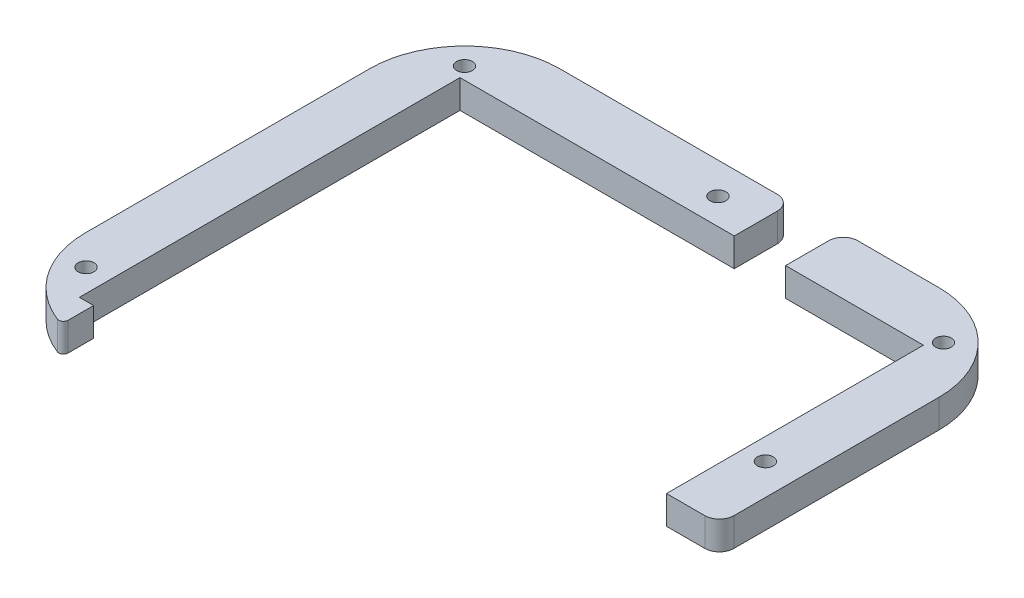
ISO-10303-21;
HEADER;
FILE_DESCRIPTION(('STEP AP214'),'2;1');
FILE_NAME('part.step','',(''),(''),'','','');
FILE_SCHEMA(('AUTOMOTIVE_DESIGN { 1 0 10303 214 1 1 1 1 }'));
ENDSEC;
DATA;
#1=APPLICATION_CONTEXT('core data for automotive mechanical design processes');
#2=APPLICATION_PROTOCOL_DEFINITION('international standard','automotive_design',2000,#1);
#3=PRODUCT_CONTEXT('',#1,'mechanical');
#4=PRODUCT('Part','Part','',(#3));
#5=PRODUCT_RELATED_PRODUCT_CATEGORY('part','',(#4));
#6=PRODUCT_DEFINITION_FORMATION('','',#4);
#7=PRODUCT_DEFINITION_CONTEXT('part definition',#1,'design');
#8=PRODUCT_DEFINITION('design','',#6,#7);
#9=PRODUCT_DEFINITION_SHAPE('','',#8);
#10=(LENGTH_UNIT() NAMED_UNIT(*) SI_UNIT(.MILLI.,.METRE.));
#11=(NAMED_UNIT(*) PLANE_ANGLE_UNIT() SI_UNIT($,.RADIAN.));
#12=(NAMED_UNIT(*) SI_UNIT($,.STERADIAN.) SOLID_ANGLE_UNIT());
#13=UNCERTAINTY_MEASURE_WITH_UNIT(LENGTH_MEASURE(1.E-05),#10,'distance_accuracy_value','');
#14=(GEOMETRIC_REPRESENTATION_CONTEXT(3) GLOBAL_UNCERTAINTY_ASSIGNED_CONTEXT((#13)) GLOBAL_UNIT_ASSIGNED_CONTEXT((#10,
#11,#12)) REPRESENTATION_CONTEXT('',''));
#15=CARTESIAN_POINT('',(0.,0.,0.));
#16=DIRECTION('',(0.,0.,1.));
#17=DIRECTION('',(1.,0.,0.));
#18=AXIS2_PLACEMENT_3D('',#15,#16,#17);
#19=CARTESIAN_POINT('',(-40.,6.,-50.08));
#20=DIRECTION('',(0.,0.,1.));
#21=DIRECTION('',(1.,0.,0.));
#22=AXIS2_PLACEMENT_3D('',#19,#20,#21);
#23=PLANE('',#22);
#24=DIRECTION('',(-1.,0.,0.));
#25=VECTOR('',#24,1.);
#26=CARTESIAN_POINT('',(-40.,0.,-50.08));
#27=LINE('',#26,#25);
#28=CARTESIAN_POINT('',(40.,0.,-50.08));
#29=VERTEX_POINT('',#28);
#30=CARTESIAN_POINT('',(22.9,0.,-50.08));
#31=VERTEX_POINT('',#30);
#32=EDGE_CURVE('E132',#29,#31,#27,.T.);
#33=ORIENTED_EDGE('',*,*,#32,.T.);
#34=DIRECTION('',(0.,1.,0.));
#35=VECTOR('',#34,1.);
#36=CARTESIAN_POINT('',(22.9,6.,-50.08));
#37=LINE('',#36,#35);
#38=CARTESIAN_POINT('',(22.9,6.,-50.08));
#39=VERTEX_POINT('',#38);
#40=EDGE_CURVE('E153',#31,#39,#37,.T.);
#41=ORIENTED_EDGE('',*,*,#40,.T.);
#42=DIRECTION('',(-1.,0.,0.));
#43=VECTOR('',#42,1.);
#44=CARTESIAN_POINT('',(-40.,6.,-50.08));
#45=LINE('',#44,#43);
#46=CARTESIAN_POINT('',(40.,6.,-50.08));
#47=VERTEX_POINT('',#46);
#48=EDGE_CURVE('E122',#47,#39,#45,.T.);
#49=ORIENTED_EDGE('',*,*,#48,.F.);
#50=DIRECTION('',(0.,1.,0.));
#51=VECTOR('',#50,1.);
#52=CARTESIAN_POINT('',(40.,6.,-50.08));
#53=LINE('',#52,#51);
#54=EDGE_CURVE('E136',#47,#29,#53,.F.);
#55=ORIENTED_EDGE('',*,*,#54,.T.);
#56=EDGE_LOOP('',(#33,#41,#49,#55));
#57=FACE_BOUND('',#56,.T.);
#58=ADVANCED_FACE('F44',(#57),#23,.F.);
#59=CARTESIAN_POINT('',(-40.,6.,-30.));
#60=DIRECTION('',(0.,1.,0.));
#61=DIRECTION('',(0.,0.,1.));
#62=AXIS2_PLACEMENT_3D('',#59,#60,#61);
#63=PLANE('',#62);
#64=CARTESIAN_POINT('',(53.475,6.,0.));
#65=DIRECTION('',(0.,1.,0.));
#66=DIRECTION('',(0.,0.,1.));
#67=AXIS2_PLACEMENT_3D('',#64,#65,#66);
#68=CIRCLE('',#67,1.67000000000001);
#69=CARTESIAN_POINT('',(53.475,6.,1.67000000000001));
#70=VERTEX_POINT('',#69);
#71=EDGE_CURVE('E48',#70,#70,#68,.T.);
#72=ORIENTED_EDGE('',*,*,#71,.F.);
#73=EDGE_LOOP('',(#72));
#74=FACE_BOUND('',#73,.T.);
#75=CARTESIAN_POINT('',(50.5585567633134,6.,-40.5085567633134));
#76=DIRECTION('',(0.,1.,0.));
#77=DIRECTION('',(0.,0.,1.));
#78=AXIS2_PLACEMENT_3D('',#75,#76,#77);
#79=CIRCLE('',#78,1.67);
#80=CARTESIAN_POINT('',(50.5585567633134,6.,-38.8385567633134));
#81=VERTEX_POINT('',#80);
#82=EDGE_CURVE('E143',#81,#81,#79,.T.);
#83=ORIENTED_EDGE('',*,*,#82,.F.);
#84=EDGE_LOOP('',(#83));
#85=FACE_BOUND('',#84,.T.);
#86=ORIENTED_EDGE('',*,*,#48,.T.);
#87=CARTESIAN_POINT('',(22.9,6.,-47.));
#88=DIRECTION('',(0.,1.,0.));
#89=DIRECTION('',(0.,0.,1.));
#90=AXIS2_PLACEMENT_3D('',#87,#88,#89);
#91=CIRCLE('',#90,3.08);
#92=CARTESIAN_POINT('',(19.82,6.,-47.));
#93=VERTEX_POINT('',#92);
#94=EDGE_CURVE('E151',#39,#93,#91,.T.);
#95=ORIENTED_EDGE('',*,*,#94,.T.);
#96=DIRECTION('',(0.,0.,-1.));
#97=VECTOR('',#96,1.);
#98=CARTESIAN_POINT('',(19.82,6.,-30.));
#99=LINE('',#98,#97);
#100=CARTESIAN_POINT('',(19.82,6.,-37.92));
#101=VERTEX_POINT('',#100);
#102=EDGE_CURVE('E154',#101,#93,#99,.T.);
#103=ORIENTED_EDGE('',*,*,#102,.F.);
#104=DIRECTION('',(-1.,0.,0.));
#105=VECTOR('',#104,1.);
#106=CARTESIAN_POINT('',(-40.,6.,-37.92));
#107=LINE('',#106,#105);
#108=CARTESIAN_POINT('',(48.92,6.,-37.92));
#109=VERTEX_POINT('',#108);
#110=EDGE_CURVE('E104',#109,#101,#107,.T.);
#111=ORIENTED_EDGE('',*,*,#110,.F.);
#112=DIRECTION('',(0.,0.,-1.));
#113=VECTOR('',#112,1.);
#114=CARTESIAN_POINT('',(48.92,6.,-30.));
#115=LINE('',#114,#113);
#116=CARTESIAN_POINT('',(48.92,6.,16.32));
#117=VERTEX_POINT('',#116);
#118=EDGE_CURVE('E111',#117,#109,#115,.T.);
#119=ORIENTED_EDGE('',*,*,#118,.F.);
#120=DIRECTION('',(-1.,0.,0.));
#121=VECTOR('',#120,1.);
#122=CARTESIAN_POINT('',(-40.,6.,16.32));
#123=LINE('',#122,#121);
#124=CARTESIAN_POINT('',(57.,6.,16.32));
#125=VERTEX_POINT('',#124);
#126=EDGE_CURVE('E171',#125,#117,#123,.T.);
#127=ORIENTED_EDGE('',*,*,#126,.F.);
#128=CARTESIAN_POINT('',(57.,6.,13.24));
#129=DIRECTION('',(0.,1.,0.));
#130=DIRECTION('',(0.,0.,1.));
#131=AXIS2_PLACEMENT_3D('',#128,#129,#130);
#132=CIRCLE('',#131,3.08);
#133=CARTESIAN_POINT('',(60.08,6.,13.24));
#134=VERTEX_POINT('',#133);
#135=EDGE_CURVE('E159',#125,#134,#132,.T.);
#136=ORIENTED_EDGE('',*,*,#135,.T.);
#137=DIRECTION('',(0.,0.,-1.));
#138=VECTOR('',#137,1.);
#139=CARTESIAN_POINT('',(60.08,6.,-30.));
#140=LINE('',#139,#138);
#141=CARTESIAN_POINT('',(60.08,6.,-30.));
#142=VERTEX_POINT('',#141);
#143=EDGE_CURVE('E180',#134,#142,#140,.T.);
#144=ORIENTED_EDGE('',*,*,#143,.T.);
#145=CARTESIAN_POINT('',(40.,6.,-30.));
#146=DIRECTION('',(0.,1.,0.));
#147=DIRECTION('',(0.,0.,1.));
#148=AXIS2_PLACEMENT_3D('',#145,#146,#147);
#149=CIRCLE('',#148,20.08);
#150=EDGE_CURVE('E127',#142,#47,#149,.T.);
#151=ORIENTED_EDGE('',*,*,#150,.T.);
#152=EDGE_LOOP('',(#86,#95,#103,#111,#119,#127,#136,#144,#151));
#153=FACE_BOUND('',#152,.T.);
#154=ADVANCED_FACE('F202',(#74,#85,#153),#63,.T.);
#155=CARTESIAN_POINT('',(-40.,0.,-30.));
#156=DIRECTION('',(0.,1.,0.));
#157=DIRECTION('',(0.,0.,1.));
#158=AXIS2_PLACEMENT_3D('',#155,#156,#157);
#159=PLANE('',#158);
#160=CARTESIAN_POINT('',(53.475,0.,0.));
#161=DIRECTION('',(0.,1.,0.));
#162=DIRECTION('',(0.,0.,1.));
#163=AXIS2_PLACEMENT_3D('',#160,#161,#162);
#164=CIRCLE('',#163,1.67000000000001);
#165=CARTESIAN_POINT('',(53.475,0.,1.67000000000001));
#166=VERTEX_POINT('',#165);
#167=EDGE_CURVE('E130',#166,#166,#164,.T.);
#168=ORIENTED_EDGE('',*,*,#167,.T.);
#169=EDGE_LOOP('',(#168));
#170=FACE_BOUND('',#169,.T.);
#171=CARTESIAN_POINT('',(50.5585567633134,0.,-40.5085567633134));
#172=DIRECTION('',(0.,1.,0.));
#173=DIRECTION('',(0.,0.,1.));
#174=AXIS2_PLACEMENT_3D('',#171,#172,#173);
#175=CIRCLE('',#174,1.67);
#176=CARTESIAN_POINT('',(50.5585567633134,0.,-38.8385567633134));
#177=VERTEX_POINT('',#176);
#178=EDGE_CURVE('E139',#177,#177,#175,.T.);
#179=ORIENTED_EDGE('',*,*,#178,.T.);
#180=EDGE_LOOP('',(#179));
#181=FACE_BOUND('',#180,.T.);
#182=DIRECTION('',(0.,0.,-1.));
#183=VECTOR('',#182,1.);
#184=CARTESIAN_POINT('',(19.82,0.,-30.));
#185=LINE('',#184,#183);
#186=CARTESIAN_POINT('',(19.82,0.,-37.92));
#187=VERTEX_POINT('',#186);
#188=CARTESIAN_POINT('',(19.82,0.,-47.));
#189=VERTEX_POINT('',#188);
#190=EDGE_CURVE('E121',#187,#189,#185,.T.);
#191=ORIENTED_EDGE('',*,*,#190,.T.);
#192=CARTESIAN_POINT('',(22.9,0.,-47.));
#193=DIRECTION('',(0.,1.,0.));
#194=DIRECTION('',(0.,0.,1.));
#195=AXIS2_PLACEMENT_3D('',#192,#193,#194);
#196=CIRCLE('',#195,3.08);
#197=EDGE_CURVE('E13',#189,#31,#196,.F.);
#198=ORIENTED_EDGE('',*,*,#197,.T.);
#199=ORIENTED_EDGE('',*,*,#32,.F.);
#200=CARTESIAN_POINT('',(40.,0.,-30.));
#201=DIRECTION('',(0.,1.,0.));
#202=DIRECTION('',(0.,0.,1.));
#203=AXIS2_PLACEMENT_3D('',#200,#201,#202);
#204=CIRCLE('',#203,20.08);
#205=CARTESIAN_POINT('',(60.08,0.,-30.));
#206=VERTEX_POINT('',#205);
#207=EDGE_CURVE('E164',#206,#29,#204,.T.);
#208=ORIENTED_EDGE('',*,*,#207,.F.);
#209=DIRECTION('',(0.,0.,-1.));
#210=VECTOR('',#209,1.);
#211=CARTESIAN_POINT('',(60.08,0.,-30.));
#212=LINE('',#211,#210);
#213=CARTESIAN_POINT('',(60.08,0.,13.24));
#214=VERTEX_POINT('',#213);
#215=EDGE_CURVE('E167',#214,#206,#212,.T.);
#216=ORIENTED_EDGE('',*,*,#215,.F.);
#217=CARTESIAN_POINT('',(57.,0.,13.24));
#218=DIRECTION('',(0.,1.,0.));
#219=DIRECTION('',(0.,0.,1.));
#220=AXIS2_PLACEMENT_3D('',#217,#218,#219);
#221=CIRCLE('',#220,3.08);
#222=CARTESIAN_POINT('',(57.,0.,16.32));
#223=VERTEX_POINT('',#222);
#224=EDGE_CURVE('E124',#214,#223,#221,.F.);
#225=ORIENTED_EDGE('',*,*,#224,.T.);
#226=DIRECTION('',(-1.,0.,0.));
#227=VECTOR('',#226,1.);
#228=CARTESIAN_POINT('',(-40.,0.,16.32));
#229=LINE('',#228,#227);
#230=CARTESIAN_POINT('',(48.92,0.,16.32));
#231=VERTEX_POINT('',#230);
#232=EDGE_CURVE('E100',#223,#231,#229,.T.);
#233=ORIENTED_EDGE('',*,*,#232,.T.);
#234=DIRECTION('',(0.,0.,-1.));
#235=VECTOR('',#234,1.);
#236=CARTESIAN_POINT('',(48.92,0.,-30.));
#237=LINE('',#236,#235);
#238=CARTESIAN_POINT('',(48.92,0.,-37.92));
#239=VERTEX_POINT('',#238);
#240=EDGE_CURVE('E94',#231,#239,#237,.T.);
#241=ORIENTED_EDGE('',*,*,#240,.T.);
#242=DIRECTION('',(-1.,0.,0.));
#243=VECTOR('',#242,1.);
#244=CARTESIAN_POINT('',(-40.,0.,-37.92));
#245=LINE('',#244,#243);
#246=EDGE_CURVE('E98',#239,#187,#245,.T.);
#247=ORIENTED_EDGE('',*,*,#246,.T.);
#248=EDGE_LOOP('',(#191,#198,#199,#208,#216,#225,#233,#241,#247));
#249=FACE_BOUND('',#248,.T.);
#250=ADVANCED_FACE('F96',(#170,#181,#249),#159,.F.);
#251=CARTESIAN_POINT('',(-49.,0.,-37.92));
#252=DIRECTION('',(0.,0.,-1.));
#253=DIRECTION('',(-1.,0.,0.));
#254=AXIS2_PLACEMENT_3D('',#251,#252,#253);
#255=PLANE('',#254);
#256=ORIENTED_EDGE('',*,*,#110,.T.);
#257=DIRECTION('',(0.,1.,0.));
#258=VECTOR('',#257,1.);
#259=CARTESIAN_POINT('',(19.82,0.,-37.92));
#260=LINE('',#259,#258);
#261=EDGE_CURVE('E120',#187,#101,#260,.T.);
#262=ORIENTED_EDGE('',*,*,#261,.F.);
#263=ORIENTED_EDGE('',*,*,#246,.F.);
#264=DIRECTION('',(0.,1.,0.));
#265=VECTOR('',#264,1.);
#266=CARTESIAN_POINT('',(48.92,0.,-37.92));
#267=LINE('',#266,#265);
#268=EDGE_CURVE('E108',#239,#109,#267,.T.);
#269=ORIENTED_EDGE('',*,*,#268,.T.);
#270=EDGE_LOOP('',(#256,#262,#263,#269));
#271=FACE_BOUND('',#270,.T.);
#272=ADVANCED_FACE('F118',(#271),#255,.F.);
#273=CARTESIAN_POINT('',(60.08,6.,-30.));
#274=DIRECTION('',(-1.,0.,0.));
#275=DIRECTION('',(0.,0.,1.));
#276=AXIS2_PLACEMENT_3D('',#273,#274,#275);
#277=PLANE('',#276);
#278=ORIENTED_EDGE('',*,*,#143,.F.);
#279=DIRECTION('',(0.,1.,0.));
#280=VECTOR('',#279,1.);
#281=CARTESIAN_POINT('',(60.08,6.,13.24));
#282=LINE('',#281,#280);
#283=EDGE_CURVE('E115',#134,#214,#282,.F.);
#284=ORIENTED_EDGE('',*,*,#283,.T.);
#285=ORIENTED_EDGE('',*,*,#215,.T.);
#286=DIRECTION('',(0.,-1.,0.));
#287=VECTOR('',#286,1.);
#288=CARTESIAN_POINT('',(60.08,6.,-30.));
#289=LINE('',#288,#287);
#290=EDGE_CURVE('E160',#142,#206,#289,.T.);
#291=ORIENTED_EDGE('',*,*,#290,.F.);
#292=EDGE_LOOP('',(#278,#284,#285,#291));
#293=FACE_BOUND('',#292,.T.);
#294=ADVANCED_FACE('F207',(#293),#277,.F.);
#295=CARTESIAN_POINT('',(40.,6.,-30.));
#296=DIRECTION('',(0.,-1.,0.));
#297=DIRECTION('',(0.,0.,-1.));
#298=AXIS2_PLACEMENT_3D('',#295,#296,#297);
#299=CYLINDRICAL_SURFACE('',#298,20.08);
#300=ORIENTED_EDGE('',*,*,#207,.T.);
#301=ORIENTED_EDGE('',*,*,#54,.F.);
#302=ORIENTED_EDGE('',*,*,#150,.F.);
#303=ORIENTED_EDGE('',*,*,#290,.T.);
#304=EDGE_LOOP('',(#300,#301,#302,#303));
#305=FACE_BOUND('',#304,.T.);
#306=ADVANCED_FACE('F212',(#305),#299,.T.);
#307=CARTESIAN_POINT('',(48.92,0.,-38.));
#308=DIRECTION('',(1.,0.,0.));
#309=DIRECTION('',(0.,0.,-1.));
#310=AXIS2_PLACEMENT_3D('',#307,#308,#309);
#311=PLANE('',#310);
#312=ORIENTED_EDGE('',*,*,#240,.F.);
#313=DIRECTION('',(0.,1.,0.));
#314=VECTOR('',#313,1.);
#315=CARTESIAN_POINT('',(48.92,0.,16.32));
#316=LINE('',#315,#314);
#317=EDGE_CURVE('E163',#231,#117,#316,.T.);
#318=ORIENTED_EDGE('',*,*,#317,.T.);
#319=ORIENTED_EDGE('',*,*,#118,.T.);
#320=ORIENTED_EDGE('',*,*,#268,.F.);
#321=EDGE_LOOP('',(#312,#318,#319,#320));
#322=FACE_BOUND('',#321,.T.);
#323=ADVANCED_FACE('F109',(#322),#311,.F.);
#324=CARTESIAN_POINT('',(49.,0.,16.32));
#325=DIRECTION('',(0.,0.,-1.));
#326=DIRECTION('',(-1.,0.,0.));
#327=AXIS2_PLACEMENT_3D('',#324,#325,#326);
#328=PLANE('',#327);
#329=ORIENTED_EDGE('',*,*,#232,.F.);
#330=DIRECTION('',(0.,1.,0.));
#331=VECTOR('',#330,1.);
#332=CARTESIAN_POINT('',(57.,0.,16.32));
#333=LINE('',#332,#331);
#334=EDGE_CURVE('E168',#223,#125,#333,.T.);
#335=ORIENTED_EDGE('',*,*,#334,.T.);
#336=ORIENTED_EDGE('',*,*,#126,.T.);
#337=ORIENTED_EDGE('',*,*,#317,.F.);
#338=EDGE_LOOP('',(#329,#335,#336,#337));
#339=FACE_BOUND('',#338,.T.);
#340=ADVANCED_FACE('F46',(#339),#328,.F.);
#341=CARTESIAN_POINT('',(57.,6.,13.24));
#342=DIRECTION('',(0.,-1.,0.));
#343=DIRECTION('',(0.,0.,-1.));
#344=AXIS2_PLACEMENT_3D('',#341,#342,#343);
#345=CYLINDRICAL_SURFACE('',#344,3.08);
#346=ORIENTED_EDGE('',*,*,#135,.F.);
#347=ORIENTED_EDGE('',*,*,#334,.F.);
#348=ORIENTED_EDGE('',*,*,#224,.F.);
#349=ORIENTED_EDGE('',*,*,#283,.F.);
#350=EDGE_LOOP('',(#346,#347,#348,#349));
#351=FACE_BOUND('',#350,.T.);
#352=ADVANCED_FACE('F197',(#351),#345,.T.);
#353=CARTESIAN_POINT('',(19.82,0.,-50.));
#354=DIRECTION('',(1.,0.,0.));
#355=DIRECTION('',(0.,0.,-1.));
#356=AXIS2_PLACEMENT_3D('',#353,#354,#355);
#357=PLANE('',#356);
#358=ORIENTED_EDGE('',*,*,#102,.T.);
#359=DIRECTION('',(0.,1.,0.));
#360=VECTOR('',#359,1.);
#361=CARTESIAN_POINT('',(19.82,0.,-47.));
#362=LINE('',#361,#360);
#363=EDGE_CURVE('E54',#93,#189,#362,.F.);
#364=ORIENTED_EDGE('',*,*,#363,.T.);
#365=ORIENTED_EDGE('',*,*,#190,.F.);
#366=ORIENTED_EDGE('',*,*,#261,.T.);
#367=EDGE_LOOP('',(#358,#364,#365,#366));
#368=FACE_BOUND('',#367,.T.);
#369=ADVANCED_FACE('F223',(#368),#357,.F.);
#370=CARTESIAN_POINT('',(22.9,6.,-47.));
#371=DIRECTION('',(0.,1.,0.));
#372=DIRECTION('',(0.,0.,1.));
#373=AXIS2_PLACEMENT_3D('',#370,#371,#372);
#374=CYLINDRICAL_SURFACE('',#373,3.08);
#375=ORIENTED_EDGE('',*,*,#197,.F.);
#376=ORIENTED_EDGE('',*,*,#363,.F.);
#377=ORIENTED_EDGE('',*,*,#94,.F.);
#378=ORIENTED_EDGE('',*,*,#40,.F.);
#379=EDGE_LOOP('',(#375,#376,#377,#378));
#380=FACE_BOUND('',#379,.T.);
#381=ADVANCED_FACE('F219',(#380),#374,.T.);
#382=CARTESIAN_POINT('',(50.5585567633134,0.,-40.5085567633134));
#383=DIRECTION('',(0.,1.,0.));
#384=DIRECTION('',(0.,0.,1.));
#385=AXIS2_PLACEMENT_3D('',#382,#383,#384);
#386=CYLINDRICAL_SURFACE('',#385,1.67);
#387=ORIENTED_EDGE('',*,*,#178,.F.);
#388=EDGE_LOOP('',(#387));
#389=FACE_BOUND('',#388,.T.);
#390=ORIENTED_EDGE('',*,*,#82,.T.);
#391=EDGE_LOOP('',(#390));
#392=FACE_BOUND('',#391,.T.);
#393=ADVANCED_FACE('F233',(#389,#392),#386,.F.);
#394=CARTESIAN_POINT('',(53.475,0.,0.));
#395=DIRECTION('',(0.,1.,0.));
#396=DIRECTION('',(0.,0.,1.));
#397=AXIS2_PLACEMENT_3D('',#394,#395,#396);
#398=CYLINDRICAL_SURFACE('',#397,1.67000000000001);
#399=ORIENTED_EDGE('',*,*,#167,.F.);
#400=EDGE_LOOP('',(#399));
#401=FACE_BOUND('',#400,.T.);
#402=ORIENTED_EDGE('',*,*,#71,.T.);
#403=EDGE_LOOP('',(#402));
#404=FACE_BOUND('',#403,.T.);
#405=ADVANCED_FACE('F259',(#401,#404),#398,.F.);
#406=CLOSED_SHELL('',(#58,#154,#250,#272,#294,#306,#323,#340,#352,#369,#381,#393,#405));
#407=MANIFOLD_SOLID_BREP('B2',#406);
#408=CARTESIAN_POINT('',(-40.,6.,-30.));
#409=DIRECTION('',(0.,-1.,0.));
#410=DIRECTION('',(0.,0.,-1.));
#411=AXIS2_PLACEMENT_3D('',#408,#409,#410);
#412=CYLINDRICAL_SURFACE('',#411,20.08);
#413=CARTESIAN_POINT('',(-40.,0.,-30.));
#414=DIRECTION('',(0.,1.,0.));
#415=DIRECTION('',(0.,0.,1.));
#416=AXIS2_PLACEMENT_3D('',#413,#414,#415);
#417=CIRCLE('',#416,20.08);
#418=CARTESIAN_POINT('',(-40.,0.,-50.08));
#419=VERTEX_POINT('',#418);
#420=CARTESIAN_POINT('',(-60.08,0.,-30.));
#421=VERTEX_POINT('',#420);
#422=EDGE_CURVE('E433',#419,#421,#417,.T.);
#423=ORIENTED_EDGE('',*,*,#422,.T.);
#424=DIRECTION('',(0.,1.,0.));
#425=VECTOR('',#424,1.);
#426=CARTESIAN_POINT('',(-60.08,6.,-30.));
#427=LINE('',#426,#425);
#428=CARTESIAN_POINT('',(-60.08,6.,-30.));
#429=VERTEX_POINT('',#428);
#430=EDGE_CURVE('E427',#429,#421,#427,.F.);
#431=ORIENTED_EDGE('',*,*,#430,.F.);
#432=CARTESIAN_POINT('',(-40.,6.,-30.));
#433=DIRECTION('',(0.,1.,0.));
#434=DIRECTION('',(0.,0.,1.));
#435=AXIS2_PLACEMENT_3D('',#432,#433,#434);
#436=CIRCLE('',#435,20.08);
#437=CARTESIAN_POINT('',(-40.,6.,-50.08));
#438=VERTEX_POINT('',#437);
#439=EDGE_CURVE('E447',#438,#429,#436,.T.);
#440=ORIENTED_EDGE('',*,*,#439,.F.);
#441=DIRECTION('',(0.,-1.,0.));
#442=VECTOR('',#441,1.);
#443=CARTESIAN_POINT('',(-40.,6.,-50.08));
#444=LINE('',#443,#442);
#445=EDGE_CURVE('E441',#438,#419,#444,.T.);
#446=ORIENTED_EDGE('',*,*,#445,.T.);
#447=EDGE_LOOP('',(#423,#431,#440,#446));
#448=FACE_BOUND('',#447,.T.);
#449=ADVANCED_FACE('F339',(#448),#412,.T.);
#450=CARTESIAN_POINT('',(-60.08,6.,-30.));
#451=DIRECTION('',(1.,0.,0.));
#452=DIRECTION('',(0.,0.,-1.));
#453=AXIS2_PLACEMENT_3D('',#450,#451,#452);
#454=PLANE('',#453);
#455=DIRECTION('',(0.,0.,1.));
#456=VECTOR('',#455,1.);
#457=CARTESIAN_POINT('',(-60.08,0.,-30.));
#458=LINE('',#457,#456);
#459=CARTESIAN_POINT('',(-60.08,0.,30.));
#460=VERTEX_POINT('',#459);
#461=EDGE_CURVE('E421',#421,#460,#458,.T.);
#462=ORIENTED_EDGE('',*,*,#461,.T.);
#463=DIRECTION('',(0.,-1.,0.));
#464=VECTOR('',#463,1.);
#465=CARTESIAN_POINT('',(-60.08,6.,30.));
#466=LINE('',#465,#464);
#467=CARTESIAN_POINT('',(-60.08,6.,30.));
#468=VERTEX_POINT('',#467);
#469=EDGE_CURVE('E424',#468,#460,#466,.T.);
#470=ORIENTED_EDGE('',*,*,#469,.F.);
#471=DIRECTION('',(0.,0.,1.));
#472=VECTOR('',#471,1.);
#473=CARTESIAN_POINT('',(-60.08,6.,-30.));
#474=LINE('',#473,#472);
#475=EDGE_CURVE('E490',#429,#468,#474,.T.);
#476=ORIENTED_EDGE('',*,*,#475,.F.);
#477=ORIENTED_EDGE('',*,*,#430,.T.);
#478=EDGE_LOOP('',(#462,#470,#476,#477));
#479=FACE_BOUND('',#478,.T.);
#480=ADVANCED_FACE('F423',(#479),#454,.F.);
#481=CARTESIAN_POINT('',(-40.,6.,30.));
#482=DIRECTION('',(0.,-1.,0.));
#483=DIRECTION('',(0.,0.,-1.));
#484=AXIS2_PLACEMENT_3D('',#481,#482,#483);
#485=CYLINDRICAL_SURFACE('',#484,20.08);
#486=CARTESIAN_POINT('',(-40.,0.,30.));
#487=DIRECTION('',(0.,1.,0.));
#488=DIRECTION('',(0.,0.,1.));
#489=AXIS2_PLACEMENT_3D('',#486,#487,#488);
#490=CIRCLE('',#489,20.08);
#491=CARTESIAN_POINT('',(-47.2826834381551,0.,48.7128010180096));
#492=VERTEX_POINT('',#491);
#493=EDGE_CURVE('E432',#460,#492,#490,.T.);
#494=ORIENTED_EDGE('',*,*,#493,.T.);
#495=DIRECTION('',(0.,-1.,0.));
#496=VECTOR('',#495,1.);
#497=CARTESIAN_POINT('',(-47.2826834381551,6.,48.7128010180096));
#498=LINE('',#497,#496);
#499=CARTESIAN_POINT('',(-47.2826834381551,6.,48.7128010180096));
#500=VERTEX_POINT('',#499);
#501=EDGE_CURVE('E456',#492,#500,#498,.F.);
#502=ORIENTED_EDGE('',*,*,#501,.T.);
#503=CARTESIAN_POINT('',(-40.,6.,30.));
#504=DIRECTION('',(0.,1.,0.));
#505=DIRECTION('',(0.,0.,1.));
#506=AXIS2_PLACEMENT_3D('',#503,#504,#505);
#507=CIRCLE('',#506,20.08);
#508=EDGE_CURVE('E440',#468,#500,#507,.T.);
#509=ORIENTED_EDGE('',*,*,#508,.F.);
#510=ORIENTED_EDGE('',*,*,#469,.T.);
#511=EDGE_LOOP('',(#494,#502,#509,#510));
#512=FACE_BOUND('',#511,.T.);
#513=ADVANCED_FACE('F437',(#512),#485,.T.);
#514=CARTESIAN_POINT('',(-45.92,0.,42.5));
#515=DIRECTION('',(-1.,0.,0.));
#516=DIRECTION('',(0.,0.,1.));
#517=AXIS2_PLACEMENT_3D('',#514,#515,#516);
#518=PLANE('',#517);
#519=DIRECTION('',(0.,0.,1.));
#520=VECTOR('',#519,1.);
#521=CARTESIAN_POINT('',(-45.92,6.,-30.));
#522=LINE('',#521,#520);
#523=CARTESIAN_POINT('',(-45.92,6.,42.42));
#524=VERTEX_POINT('',#523);
#525=CARTESIAN_POINT('',(-45.92,6.,47.7808886167143));
#526=VERTEX_POINT('',#525);
#527=EDGE_CURVE('E472',#524,#526,#522,.T.);
#528=ORIENTED_EDGE('',*,*,#527,.T.);
#529=DIRECTION('',(0.,-1.,0.));
#530=VECTOR('',#529,1.);
#531=CARTESIAN_POINT('',(-45.92,0.,47.7808886167143));
#532=LINE('',#531,#530);
#533=CARTESIAN_POINT('',(-45.92,0.,47.7808886167143));
#534=VERTEX_POINT('',#533);
#535=EDGE_CURVE('E347',#526,#534,#532,.T.);
#536=ORIENTED_EDGE('',*,*,#535,.T.);
#537=DIRECTION('',(0.,0.,1.));
#538=VECTOR('',#537,1.);
#539=CARTESIAN_POINT('',(-45.92,0.,-30.));
#540=LINE('',#539,#538);
#541=CARTESIAN_POINT('',(-45.92,0.,42.42));
#542=VERTEX_POINT('',#541);
#543=EDGE_CURVE('E450',#542,#534,#540,.T.);
#544=ORIENTED_EDGE('',*,*,#543,.F.);
#545=DIRECTION('',(0.,1.,0.));
#546=VECTOR('',#545,1.);
#547=CARTESIAN_POINT('',(-45.92,0.,42.42));
#548=LINE('',#547,#546);
#549=EDGE_CURVE('E528',#542,#524,#548,.T.);
#550=ORIENTED_EDGE('',*,*,#549,.T.);
#551=EDGE_LOOP('',(#528,#536,#544,#550));
#552=FACE_BOUND('',#551,.T.);
#553=ADVANCED_FACE('F531',(#552),#518,.F.);
#554=CARTESIAN_POINT('',(-49.,0.,42.42));
#555=DIRECTION('',(0.,0.,1.));
#556=DIRECTION('',(1.,0.,0.));
#557=AXIS2_PLACEMENT_3D('',#554,#555,#556);
#558=PLANE('',#557);
#559=DIRECTION('',(1.,0.,0.));
#560=VECTOR('',#559,1.);
#561=CARTESIAN_POINT('',(-40.,6.,42.42));
#562=LINE('',#561,#560);
#563=CARTESIAN_POINT('',(-48.92,6.,42.42));
#564=VERTEX_POINT('',#563);
#565=EDGE_CURVE('E474',#564,#524,#562,.T.);
#566=ORIENTED_EDGE('',*,*,#565,.T.);
#567=ORIENTED_EDGE('',*,*,#549,.F.);
#568=DIRECTION('',(1.,0.,0.));
#569=VECTOR('',#568,1.);
#570=CARTESIAN_POINT('',(-40.,0.,42.42));
#571=LINE('',#570,#569);
#572=CARTESIAN_POINT('',(-48.92,0.,42.42));
#573=VERTEX_POINT('',#572);
#574=EDGE_CURVE('E468',#573,#542,#571,.T.);
#575=ORIENTED_EDGE('',*,*,#574,.F.);
#576=DIRECTION('',(0.,1.,0.));
#577=VECTOR('',#576,1.);
#578=CARTESIAN_POINT('',(-48.92,0.,42.42));
#579=LINE('',#578,#577);
#580=EDGE_CURVE('E464',#573,#564,#579,.T.);
#581=ORIENTED_EDGE('',*,*,#580,.T.);
#582=EDGE_LOOP('',(#566,#567,#575,#581));
#583=FACE_BOUND('',#582,.T.);
#584=ADVANCED_FACE('F535',(#583),#558,.F.);
#585=CARTESIAN_POINT('',(-48.92,0.,-38.));
#586=DIRECTION('',(-1.,0.,0.));
#587=DIRECTION('',(0.,0.,1.));
#588=AXIS2_PLACEMENT_3D('',#585,#586,#587);
#589=PLANE('',#588);
#590=DIRECTION('',(0.,0.,1.));
#591=VECTOR('',#590,1.);
#592=CARTESIAN_POINT('',(-48.92,6.,-30.));
#593=LINE('',#592,#591);
#594=CARTESIAN_POINT('',(-48.92,6.,-37.92));
#595=VERTEX_POINT('',#594);
#596=EDGE_CURVE('E477',#595,#564,#593,.T.);
#597=ORIENTED_EDGE('',*,*,#596,.T.);
#598=ORIENTED_EDGE('',*,*,#580,.F.);
#599=DIRECTION('',(0.,0.,1.));
#600=VECTOR('',#599,1.);
#601=CARTESIAN_POINT('',(-48.92,0.,-30.));
#602=LINE('',#601,#600);
#603=CARTESIAN_POINT('',(-48.92,0.,-37.92));
#604=VERTEX_POINT('',#603);
#605=EDGE_CURVE('E465',#604,#573,#602,.T.);
#606=ORIENTED_EDGE('',*,*,#605,.F.);
#607=DIRECTION('',(0.,1.,0.));
#608=VECTOR('',#607,1.);
#609=CARTESIAN_POINT('',(-48.92,0.,-37.92));
#610=LINE('',#609,#608);
#611=EDGE_CURVE('E452',#604,#595,#610,.T.);
#612=ORIENTED_EDGE('',*,*,#611,.T.);
#613=EDGE_LOOP('',(#597,#598,#606,#612));
#614=FACE_BOUND('',#613,.T.);
#615=ADVANCED_FACE('F540',(#614),#589,.F.);
#616=CARTESIAN_POINT('',(-49.,0.,-37.92));
#617=DIRECTION('',(0.,0.,-1.));
#618=DIRECTION('',(-1.,0.,0.));
#619=AXIS2_PLACEMENT_3D('',#616,#617,#618);
#620=PLANE('',#619);
#621=DIRECTION('',(-1.,0.,0.));
#622=VECTOR('',#621,1.);
#623=CARTESIAN_POINT('',(-40.,0.,-37.92));
#624=LINE('',#623,#622);
#625=CARTESIAN_POINT('',(8.98000000000003,0.,-37.92));
#626=VERTEX_POINT('',#625);
#627=EDGE_CURVE('E462',#626,#604,#624,.T.);
#628=ORIENTED_EDGE('',*,*,#627,.F.);
#629=DIRECTION('',(0.,1.,0.));
#630=VECTOR('',#629,1.);
#631=CARTESIAN_POINT('',(8.98000000000004,0.,-37.92));
#632=LINE('',#631,#630);
#633=CARTESIAN_POINT('',(8.98000000000003,6.,-37.92));
#634=VERTEX_POINT('',#633);
#635=EDGE_CURVE('E460',#626,#634,#632,.T.);
#636=ORIENTED_EDGE('',*,*,#635,.T.);
#637=DIRECTION('',(-1.,0.,0.));
#638=VECTOR('',#637,1.);
#639=CARTESIAN_POINT('',(-40.,6.,-37.92));
#640=LINE('',#639,#638);
#641=EDGE_CURVE('E469',#634,#595,#640,.T.);
#642=ORIENTED_EDGE('',*,*,#641,.T.);
#643=ORIENTED_EDGE('',*,*,#611,.F.);
#644=EDGE_LOOP('',(#628,#636,#642,#643));
#645=FACE_BOUND('',#644,.T.);
#646=ADVANCED_FACE('F545',(#645),#620,.F.);
#647=CARTESIAN_POINT('',(-40.,0.,-30.));
#648=DIRECTION('',(0.,1.,0.));
#649=DIRECTION('',(0.,0.,1.));
#650=AXIS2_PLACEMENT_3D('',#647,#648,#649);
#651=PLANE('',#650);
#652=CARTESIAN_POINT('',(0.,0.,-43.45));
#653=DIRECTION('',(0.,1.,0.));
#654=DIRECTION('',(0.,0.,1.));
#655=AXIS2_PLACEMENT_3D('',#652,#653,#654);
#656=CIRCLE('',#655,1.67);
#657=CARTESIAN_POINT('',(0.,0.,-41.78));
#658=VERTEX_POINT('',#657);
#659=EDGE_CURVE('E482',#658,#658,#656,.T.);
#660=ORIENTED_EDGE('',*,*,#659,.T.);
#661=EDGE_LOOP('',(#660));
#662=FACE_BOUND('',#661,.T.);
#663=CARTESIAN_POINT('',(-50.5585567633134,0.,-40.5085567633135));
#664=DIRECTION('',(0.,1.,0.));
#665=DIRECTION('',(0.,0.,1.));
#666=AXIS2_PLACEMENT_3D('',#663,#664,#665);
#667=CIRCLE('',#666,1.67000000000002);
#668=CARTESIAN_POINT('',(-50.5585567633134,0.,-38.8385567633135));
#669=VERTEX_POINT('',#668);
#670=EDGE_CURVE('E500',#669,#669,#667,.T.);
#671=ORIENTED_EDGE('',*,*,#670,.T.);
#672=EDGE_LOOP('',(#671));
#673=FACE_BOUND('',#672,.T.);
#674=CARTESIAN_POINT('',(-53.7092926056018,0.,36.2273752960606));
#675=DIRECTION('',(0.,1.,0.));
#676=DIRECTION('',(0.,0.,1.));
#677=AXIS2_PLACEMENT_3D('',#674,#675,#676);
#678=CIRCLE('',#677,1.67000000000001);
#679=CARTESIAN_POINT('',(-53.7092926056018,0.,37.8973752960606));
#680=VERTEX_POINT('',#679);
#681=EDGE_CURVE('E493',#680,#680,#678,.T.);
#682=ORIENTED_EDGE('',*,*,#681,.T.);
#683=EDGE_LOOP('',(#682));
#684=FACE_BOUND('',#683,.T.);
#685=ORIENTED_EDGE('',*,*,#543,.T.);
#686=CARTESIAN_POINT('',(-46.92,0.,47.7808886167143));
#687=DIRECTION('',(0.,1.,0.));
#688=DIRECTION('',(0.,0.,1.));
#689=AXIS2_PLACEMENT_3D('',#686,#687,#688);
#690=CIRCLE('',#689,1.);
#691=EDGE_CURVE('E42',#534,#492,#690,.F.);
#692=ORIENTED_EDGE('',*,*,#691,.T.);
#693=ORIENTED_EDGE('',*,*,#493,.F.);
#694=ORIENTED_EDGE('',*,*,#461,.F.);
#695=ORIENTED_EDGE('',*,*,#422,.F.);
#696=DIRECTION('',(-1.,0.,0.));
#697=VECTOR('',#696,1.);
#698=CARTESIAN_POINT('',(-40.,0.,-50.08));
#699=LINE('',#698,#697);
#700=CARTESIAN_POINT('',(5.90000000000003,0.,-50.08));
#701=VERTEX_POINT('',#700);
#702=EDGE_CURVE('E445',#701,#419,#699,.T.);
#703=ORIENTED_EDGE('',*,*,#702,.F.);
#704=CARTESIAN_POINT('',(5.90000000000003,0.,-47.));
#705=DIRECTION('',(0.,1.,0.));
#706=DIRECTION('',(0.,0.,1.));
#707=AXIS2_PLACEMENT_3D('',#704,#705,#706);
#708=CIRCLE('',#707,3.08);
#709=CARTESIAN_POINT('',(8.98000000000003,0.,-47.));
#710=VERTEX_POINT('',#709);
#711=EDGE_CURVE('E454',#701,#710,#708,.F.);
#712=ORIENTED_EDGE('',*,*,#711,.T.);
#713=DIRECTION('',(0.,0.,1.));
#714=VECTOR('',#713,1.);
#715=CARTESIAN_POINT('',(8.98000000000004,0.,-30.));
#716=LINE('',#715,#714);
#717=EDGE_CURVE('E458',#710,#626,#716,.T.);
#718=ORIENTED_EDGE('',*,*,#717,.T.);
#719=ORIENTED_EDGE('',*,*,#627,.T.);
#720=ORIENTED_EDGE('',*,*,#605,.T.);
#721=ORIENTED_EDGE('',*,*,#574,.T.);
#722=EDGE_LOOP('',(#685,#692,#693,#694,#695,#703,#712,#718,#719,#720,#721));
#723=FACE_BOUND('',#722,.T.);
#724=ADVANCED_FACE('F443',(#662,#673,#684,#723),#651,.F.);
#725=CARTESIAN_POINT('',(-40.,6.,-30.));
#726=DIRECTION('',(0.,1.,0.));
#727=DIRECTION('',(0.,0.,1.));
#728=AXIS2_PLACEMENT_3D('',#725,#726,#727);
#729=PLANE('',#728);
#730=CARTESIAN_POINT('',(0.,6.,-43.45));
#731=DIRECTION('',(0.,1.,0.));
#732=DIRECTION('',(0.,0.,1.));
#733=AXIS2_PLACEMENT_3D('',#730,#731,#732);
#734=CIRCLE('',#733,1.67);
#735=CARTESIAN_POINT('',(0.,6.,-41.78));
#736=VERTEX_POINT('',#735);
#737=EDGE_CURVE('E503',#736,#736,#734,.T.);
#738=ORIENTED_EDGE('',*,*,#737,.F.);
#739=EDGE_LOOP('',(#738));
#740=FACE_BOUND('',#739,.T.);
#741=CARTESIAN_POINT('',(-50.5585567633134,6.,-40.5085567633135));
#742=DIRECTION('',(0.,1.,0.));
#743=DIRECTION('',(0.,0.,1.));
#744=AXIS2_PLACEMENT_3D('',#741,#742,#743);
#745=CIRCLE('',#744,1.67000000000002);
#746=CARTESIAN_POINT('',(-50.5585567633134,6.,-38.8385567633135));
#747=VERTEX_POINT('',#746);
#748=EDGE_CURVE('E496',#747,#747,#745,.T.);
#749=ORIENTED_EDGE('',*,*,#748,.F.);
#750=EDGE_LOOP('',(#749));
#751=FACE_BOUND('',#750,.T.);
#752=CARTESIAN_POINT('',(-53.7092926056018,6.,36.2273752960606));
#753=DIRECTION('',(0.,1.,0.));
#754=DIRECTION('',(0.,0.,1.));
#755=AXIS2_PLACEMENT_3D('',#752,#753,#754);
#756=CIRCLE('',#755,1.67000000000001);
#757=CARTESIAN_POINT('',(-53.7092926056018,6.,37.8973752960606));
#758=VERTEX_POINT('',#757);
#759=EDGE_CURVE('E497',#758,#758,#756,.T.);
#760=ORIENTED_EDGE('',*,*,#759,.F.);
#761=EDGE_LOOP('',(#760));
#762=FACE_BOUND('',#761,.T.);
#763=ORIENTED_EDGE('',*,*,#508,.T.);
#764=CARTESIAN_POINT('',(-46.92,6.,47.7808886167143));
#765=DIRECTION('',(0.,1.,0.));
#766=DIRECTION('',(0.,0.,1.));
#767=AXIS2_PLACEMENT_3D('',#764,#765,#766);
#768=CIRCLE('',#767,1.);
#769=EDGE_CURVE('E361',#500,#526,#768,.T.);
#770=ORIENTED_EDGE('',*,*,#769,.T.);
#771=ORIENTED_EDGE('',*,*,#527,.F.);
#772=ORIENTED_EDGE('',*,*,#565,.F.);
#773=ORIENTED_EDGE('',*,*,#596,.F.);
#774=ORIENTED_EDGE('',*,*,#641,.F.);
#775=DIRECTION('',(0.,0.,1.));
#776=VECTOR('',#775,1.);
#777=CARTESIAN_POINT('',(8.98000000000004,6.,-30.));
#778=LINE('',#777,#776);
#779=CARTESIAN_POINT('',(8.98000000000003,6.,-47.));
#780=VERTEX_POINT('',#779);
#781=EDGE_CURVE('E461',#780,#634,#778,.T.);
#782=ORIENTED_EDGE('',*,*,#781,.F.);
#783=CARTESIAN_POINT('',(5.90000000000003,6.,-47.));
#784=DIRECTION('',(0.,1.,0.));
#785=DIRECTION('',(0.,0.,1.));
#786=AXIS2_PLACEMENT_3D('',#783,#784,#785);
#787=CIRCLE('',#786,3.08);
#788=CARTESIAN_POINT('',(5.90000000000003,6.,-50.08));
#789=VERTEX_POINT('',#788);
#790=EDGE_CURVE('E483',#780,#789,#787,.T.);
#791=ORIENTED_EDGE('',*,*,#790,.T.);
#792=DIRECTION('',(-1.,0.,0.));
#793=VECTOR('',#792,1.);
#794=CARTESIAN_POINT('',(-40.,6.,-50.08));
#795=LINE('',#794,#793);
#796=EDGE_CURVE('E486',#789,#438,#795,.T.);
#797=ORIENTED_EDGE('',*,*,#796,.T.);
#798=ORIENTED_EDGE('',*,*,#439,.T.);
#799=ORIENTED_EDGE('',*,*,#475,.T.);
#800=EDGE_LOOP('',(#763,#770,#771,#772,#773,#774,#782,#791,#797,#798,#799));
#801=FACE_BOUND('',#800,.T.);
#802=ADVANCED_FACE('F512',(#740,#751,#762,#801),#729,.T.);
#803=CARTESIAN_POINT('',(-40.,6.,-50.08));
#804=DIRECTION('',(0.,0.,1.));
#805=DIRECTION('',(1.,0.,0.));
#806=AXIS2_PLACEMENT_3D('',#803,#804,#805);
#807=PLANE('',#806);
#808=ORIENTED_EDGE('',*,*,#796,.F.);
#809=DIRECTION('',(0.,1.,0.));
#810=VECTOR('',#809,1.);
#811=CARTESIAN_POINT('',(5.90000000000003,6.,-50.08));
#812=LINE('',#811,#810);
#813=EDGE_CURVE('E457',#789,#701,#812,.F.);
#814=ORIENTED_EDGE('',*,*,#813,.T.);
#815=ORIENTED_EDGE('',*,*,#702,.T.);
#816=ORIENTED_EDGE('',*,*,#445,.F.);
#817=EDGE_LOOP('',(#808,#814,#815,#816));
#818=FACE_BOUND('',#817,.T.);
#819=ADVANCED_FACE('F554',(#818),#807,.F.);
#820=CARTESIAN_POINT('',(8.98000000000003,0.,-50.));
#821=DIRECTION('',(-1.,0.,0.));
#822=DIRECTION('',(0.,0.,1.));
#823=AXIS2_PLACEMENT_3D('',#820,#821,#822);
#824=PLANE('',#823);
#825=ORIENTED_EDGE('',*,*,#717,.F.);
#826=DIRECTION('',(0.,1.,0.));
#827=VECTOR('',#826,1.);
#828=CARTESIAN_POINT('',(8.98000000000003,0.,-47.));
#829=LINE('',#828,#827);
#830=EDGE_CURVE('E485',#710,#780,#829,.T.);
#831=ORIENTED_EDGE('',*,*,#830,.T.);
#832=ORIENTED_EDGE('',*,*,#781,.T.);
#833=ORIENTED_EDGE('',*,*,#635,.F.);
#834=EDGE_LOOP('',(#825,#831,#832,#833));
#835=FACE_BOUND('',#834,.T.);
#836=ADVANCED_FACE('F549',(#835),#824,.F.);
#837=CARTESIAN_POINT('',(5.90000000000003,0.,-47.));
#838=DIRECTION('',(0.,1.,0.));
#839=DIRECTION('',(0.,0.,1.));
#840=AXIS2_PLACEMENT_3D('',#837,#838,#839);
#841=CYLINDRICAL_SURFACE('',#840,3.08);
#842=ORIENTED_EDGE('',*,*,#711,.F.);
#843=ORIENTED_EDGE('',*,*,#813,.F.);
#844=ORIENTED_EDGE('',*,*,#790,.F.);
#845=ORIENTED_EDGE('',*,*,#830,.F.);
#846=EDGE_LOOP('',(#842,#843,#844,#845));
#847=FACE_BOUND('',#846,.T.);
#848=ADVANCED_FACE('F557',(#847),#841,.T.);
#849=CARTESIAN_POINT('',(-53.7092926056018,0.,36.2273752960606));
#850=DIRECTION('',(0.,1.,0.));
#851=DIRECTION('',(0.,0.,1.));
#852=AXIS2_PLACEMENT_3D('',#849,#850,#851);
#853=CYLINDRICAL_SURFACE('',#852,1.67000000000001);
#854=ORIENTED_EDGE('',*,*,#681,.F.);
#855=EDGE_LOOP('',(#854));
#856=FACE_BOUND('',#855,.T.);
#857=ORIENTED_EDGE('',*,*,#759,.T.);
#858=EDGE_LOOP('',(#857));
#859=FACE_BOUND('',#858,.T.);
#860=ADVANCED_FACE('F578',(#856,#859),#853,.F.);
#861=CARTESIAN_POINT('',(-50.5585567633134,0.,-40.5085567633135));
#862=DIRECTION('',(0.,1.,0.));
#863=DIRECTION('',(0.,0.,1.));
#864=AXIS2_PLACEMENT_3D('',#861,#862,#863);
#865=CYLINDRICAL_SURFACE('',#864,1.67000000000002);
#866=ORIENTED_EDGE('',*,*,#670,.F.);
#867=EDGE_LOOP('',(#866));
#868=FACE_BOUND('',#867,.T.);
#869=ORIENTED_EDGE('',*,*,#748,.T.);
#870=EDGE_LOOP('',(#869));
#871=FACE_BOUND('',#870,.T.);
#872=ADVANCED_FACE('F563',(#868,#871),#865,.F.);
#873=CARTESIAN_POINT('',(0.,0.,-43.45));
#874=DIRECTION('',(0.,1.,0.));
#875=DIRECTION('',(0.,0.,1.));
#876=AXIS2_PLACEMENT_3D('',#873,#874,#875);
#877=CYLINDRICAL_SURFACE('',#876,1.67);
#878=ORIENTED_EDGE('',*,*,#659,.F.);
#879=EDGE_LOOP('',(#878));
#880=FACE_BOUND('',#879,.T.);
#881=ORIENTED_EDGE('',*,*,#737,.T.);
#882=EDGE_LOOP('',(#881));
#883=FACE_BOUND('',#882,.T.);
#884=ADVANCED_FACE('F559',(#880,#883),#877,.F.);
#885=CARTESIAN_POINT('',(-46.92,6.,47.7808886167143));
#886=DIRECTION('',(0.,-1.,0.));
#887=DIRECTION('',(0.,0.,-1.));
#888=AXIS2_PLACEMENT_3D('',#885,#886,#887);
#889=CYLINDRICAL_SURFACE('',#888,1.);
#890=ORIENTED_EDGE('',*,*,#691,.F.);
#891=ORIENTED_EDGE('',*,*,#535,.F.);
#892=ORIENTED_EDGE('',*,*,#769,.F.);
#893=ORIENTED_EDGE('',*,*,#501,.F.);
#894=EDGE_LOOP('',(#890,#891,#892,#893));
#895=FACE_BOUND('',#894,.T.);
#896=ADVANCED_FACE('F341',(#895),#889,.T.);
#897=CLOSED_SHELL('',(#449,#480,#513,#553,#584,#615,#646,#724,#802,#819,#836,#848,#860,#872,
#884,#896));
#898=MANIFOLD_SOLID_BREP('B7',#897);
#899=ADVANCED_BREP_SHAPE_REPRESENTATION('',(#18,#407,#898),#14);
#900=SHAPE_DEFINITION_REPRESENTATION(#9,#899);
ENDSEC;
END-ISO-10303-21;
